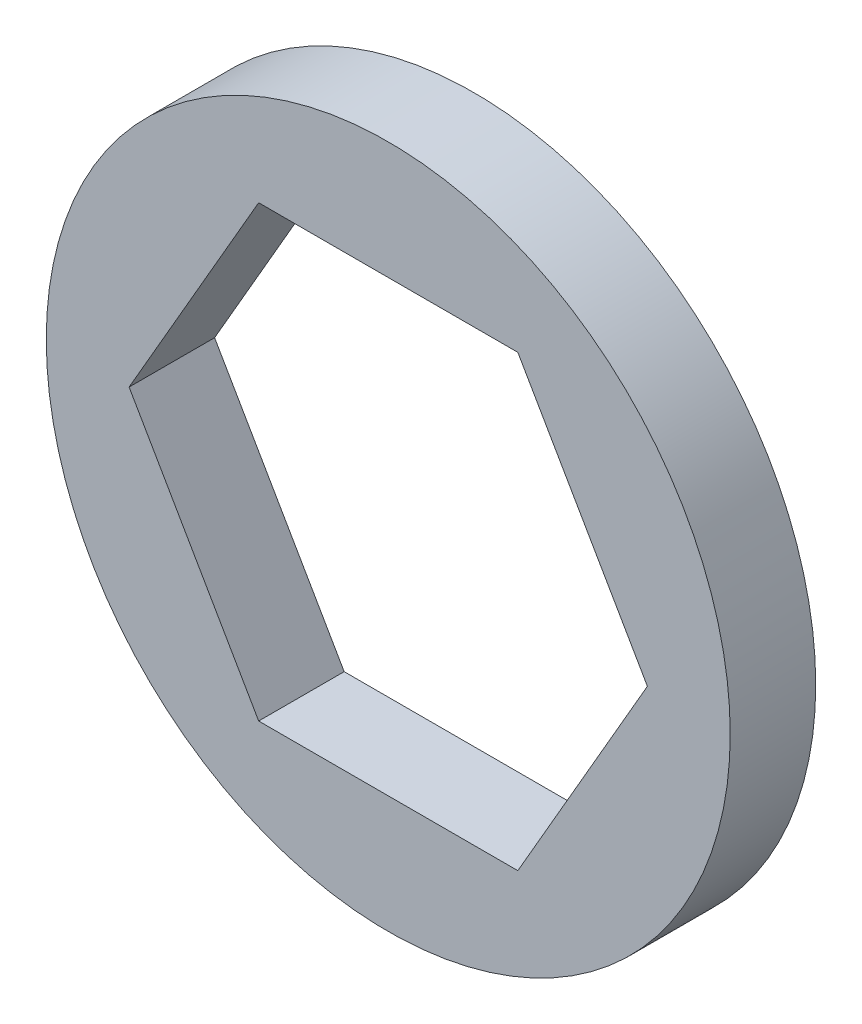
ISO-10303-21;
HEADER;
FILE_DESCRIPTION(('STEP AP214'),'2;1');
FILE_NAME('part.step','',(''),(''),'','','');
FILE_SCHEMA(('AUTOMOTIVE_DESIGN { 1 0 10303 214 1 1 1 1 }'));
ENDSEC;
DATA;
#1=APPLICATION_CONTEXT('core data for automotive mechanical design processes');
#2=APPLICATION_PROTOCOL_DEFINITION('international standard','automotive_design',2000,#1);
#3=PRODUCT_CONTEXT('',#1,'mechanical');
#4=PRODUCT('Part','Part','',(#3));
#5=PRODUCT_RELATED_PRODUCT_CATEGORY('part','',(#4));
#6=PRODUCT_DEFINITION_FORMATION('','',#4);
#7=PRODUCT_DEFINITION_CONTEXT('part definition',#1,'design');
#8=PRODUCT_DEFINITION('design','',#6,#7);
#9=PRODUCT_DEFINITION_SHAPE('','',#8);
#10=(LENGTH_UNIT() NAMED_UNIT(*) SI_UNIT(.MILLI.,.METRE.));
#11=(NAMED_UNIT(*) PLANE_ANGLE_UNIT() SI_UNIT($,.RADIAN.));
#12=(NAMED_UNIT(*) SI_UNIT($,.STERADIAN.) SOLID_ANGLE_UNIT());
#13=UNCERTAINTY_MEASURE_WITH_UNIT(LENGTH_MEASURE(1.E-05),#10,'distance_accuracy_value','');
#14=(GEOMETRIC_REPRESENTATION_CONTEXT(3) GLOBAL_UNCERTAINTY_ASSIGNED_CONTEXT((#13)) GLOBAL_UNIT_ASSIGNED_CONTEXT((#10,
#11,#12)) REPRESENTATION_CONTEXT('',''));
#15=CARTESIAN_POINT('',(0.,0.,0.));
#16=DIRECTION('',(0.,0.,1.));
#17=DIRECTION('',(1.,0.,0.));
#18=AXIS2_PLACEMENT_3D('',#15,#16,#17);
#19=CARTESIAN_POINT('',(0.,0.,1.));
#20=DIRECTION('',(0.,0.,1.));
#21=DIRECTION('',(1.,0.,0.));
#22=AXIS2_PLACEMENT_3D('',#19,#20,#21);
#23=PLANE('',#22);
#24=CARTESIAN_POINT('',(0.,0.,1.));
#25=DIRECTION('',(0.,0.,1.));
#26=DIRECTION('',(1.,0.,0.));
#27=AXIS2_PLACEMENT_3D('',#24,#25,#26);
#28=CIRCLE('',#27,4.);
#29=CARTESIAN_POINT('',(4.,0.,1.));
#30=VERTEX_POINT('',#29);
#31=EDGE_CURVE('E11',#30,#30,#28,.T.);
#32=ORIENTED_EDGE('',*,*,#31,.T.);
#33=EDGE_LOOP('',(#32));
#34=FACE_BOUND('',#33,.T.);
#35=DIRECTION('',(-0.500000000000001,0.866025403784438,0.));
#36=VECTOR('',#35,1.);
#37=CARTESIAN_POINT('',(3.03108891324552,0.,1.));
#38=LINE('',#37,#36);
#39=CARTESIAN_POINT('',(3.03108891324552,0.,1.));
#40=VERTEX_POINT('',#39);
#41=CARTESIAN_POINT('',(1.51554445662275,2.62499999999999,1.));
#42=VERTEX_POINT('',#41);
#43=EDGE_CURVE('E108',#40,#42,#38,.T.);
#44=ORIENTED_EDGE('',*,*,#43,.F.);
#45=DIRECTION('',(0.499999999999995,0.866025403784441,0.));
#46=VECTOR('',#45,1.);
#47=CARTESIAN_POINT('',(1.51554445662279,-2.62499999999997,1.));
#48=LINE('',#47,#46);
#49=CARTESIAN_POINT('',(1.51554445662279,-2.62499999999997,1.));
#50=VERTEX_POINT('',#49);
#51=EDGE_CURVE('E100',#50,#40,#48,.T.);
#52=ORIENTED_EDGE('',*,*,#51,.F.);
#53=DIRECTION('',(1.,0.,0.));
#54=VECTOR('',#53,1.);
#55=CARTESIAN_POINT('',(-1.51554445662274,-2.625,1.));
#56=LINE('',#55,#54);
#57=CARTESIAN_POINT('',(-1.51554445662274,-2.625,1.));
#58=VERTEX_POINT('',#57);
#59=EDGE_CURVE('E130',#58,#50,#56,.T.);
#60=ORIENTED_EDGE('',*,*,#59,.F.);
#61=DIRECTION('',(0.500000000000007,-0.866025403784435,0.));
#62=VECTOR('',#61,1.);
#63=CARTESIAN_POINT('',(-3.03108891324552,0.,1.));
#64=LINE('',#63,#62);
#65=CARTESIAN_POINT('',(-3.03108891324552,0.,1.));
#66=VERTEX_POINT('',#65);
#67=EDGE_CURVE('E127',#66,#58,#64,.T.);
#68=ORIENTED_EDGE('',*,*,#67,.F.);
#69=DIRECTION('',(-0.499999999999995,-0.866025403784442,0.));
#70=VECTOR('',#69,1.);
#71=CARTESIAN_POINT('',(-1.51554445662277,2.62499999999998,1.));
#72=LINE('',#71,#70);
#73=CARTESIAN_POINT('',(-1.51554445662277,2.62499999999998,1.));
#74=VERTEX_POINT('',#73);
#75=EDGE_CURVE('E122',#74,#66,#72,.T.);
#76=ORIENTED_EDGE('',*,*,#75,.F.);
#77=DIRECTION('',(-1.,0.,0.));
#78=VECTOR('',#77,1.);
#79=CARTESIAN_POINT('',(1.51554445662275,2.62499999999999,1.));
#80=LINE('',#79,#78);
#81=EDGE_CURVE('E120',#42,#74,#80,.T.);
#82=ORIENTED_EDGE('',*,*,#81,.F.);
#83=EDGE_LOOP('',(#44,#52,#60,#68,#76,#82));
#84=FACE_BOUND('',#83,.T.);
#85=ADVANCED_FACE('F45',(#34,#84),#23,.T.);
#86=CARTESIAN_POINT('',(0.,0.,0.));
#87=DIRECTION('',(0.,0.,1.));
#88=DIRECTION('',(1.,0.,0.));
#89=AXIS2_PLACEMENT_3D('',#86,#87,#88);
#90=PLANE('',#89);
#91=CARTESIAN_POINT('',(0.,0.,0.));
#92=DIRECTION('',(0.,0.,1.));
#93=DIRECTION('',(1.,0.,0.));
#94=AXIS2_PLACEMENT_3D('',#91,#92,#93);
#95=CIRCLE('',#94,4.);
#96=CARTESIAN_POINT('',(4.,0.,0.));
#97=VERTEX_POINT('',#96);
#98=EDGE_CURVE('E49',#97,#97,#95,.T.);
#99=ORIENTED_EDGE('',*,*,#98,.F.);
#100=EDGE_LOOP('',(#99));
#101=FACE_BOUND('',#100,.T.);
#102=DIRECTION('',(0.499999999999995,0.866025403784441,0.));
#103=VECTOR('',#102,1.);
#104=CARTESIAN_POINT('',(1.51554445662279,-2.62499999999997,0.));
#105=LINE('',#104,#103);
#106=CARTESIAN_POINT('',(1.51554445662279,-2.62499999999997,0.));
#107=VERTEX_POINT('',#106);
#108=CARTESIAN_POINT('',(3.03108891324552,0.,0.));
#109=VERTEX_POINT('',#108);
#110=EDGE_CURVE('E69',#107,#109,#105,.T.);
#111=ORIENTED_EDGE('',*,*,#110,.T.);
#112=DIRECTION('',(-0.500000000000001,0.866025403784438,0.));
#113=VECTOR('',#112,1.);
#114=CARTESIAN_POINT('',(3.03108891324552,0.,0.));
#115=LINE('',#114,#113);
#116=CARTESIAN_POINT('',(1.51554445662275,2.62499999999999,0.));
#117=VERTEX_POINT('',#116);
#118=EDGE_CURVE('E115',#109,#117,#115,.T.);
#119=ORIENTED_EDGE('',*,*,#118,.T.);
#120=DIRECTION('',(-1.,0.,0.));
#121=VECTOR('',#120,1.);
#122=CARTESIAN_POINT('',(1.51554445662275,2.62499999999999,0.));
#123=LINE('',#122,#121);
#124=CARTESIAN_POINT('',(-1.51554445662277,2.62499999999998,0.));
#125=VERTEX_POINT('',#124);
#126=EDGE_CURVE('E134',#117,#125,#123,.T.);
#127=ORIENTED_EDGE('',*,*,#126,.T.);
#128=DIRECTION('',(-0.499999999999995,-0.866025403784442,0.));
#129=VECTOR('',#128,1.);
#130=CARTESIAN_POINT('',(-1.51554445662277,2.62499999999998,0.));
#131=LINE('',#130,#129);
#132=CARTESIAN_POINT('',(-3.03108891324552,0.,0.));
#133=VERTEX_POINT('',#132);
#134=EDGE_CURVE('E137',#125,#133,#131,.T.);
#135=ORIENTED_EDGE('',*,*,#134,.T.);
#136=DIRECTION('',(0.500000000000007,-0.866025403784435,0.));
#137=VECTOR('',#136,1.);
#138=CARTESIAN_POINT('',(-3.03108891324552,0.,0.));
#139=LINE('',#138,#137);
#140=CARTESIAN_POINT('',(-1.51554445662274,-2.625,0.));
#141=VERTEX_POINT('',#140);
#142=EDGE_CURVE('E140',#133,#141,#139,.T.);
#143=ORIENTED_EDGE('',*,*,#142,.T.);
#144=DIRECTION('',(1.,0.,0.));
#145=VECTOR('',#144,1.);
#146=CARTESIAN_POINT('',(-1.51554445662274,-2.625,0.));
#147=LINE('',#146,#145);
#148=EDGE_CURVE('E109',#141,#107,#147,.T.);
#149=ORIENTED_EDGE('',*,*,#148,.T.);
#150=EDGE_LOOP('',(#111,#119,#127,#135,#143,#149));
#151=FACE_BOUND('',#150,.T.);
#152=ADVANCED_FACE('F158',(#101,#151),#90,.F.);
#153=CARTESIAN_POINT('',(0.,0.,1.));
#154=DIRECTION('',(0.,0.,-1.));
#155=DIRECTION('',(-1.,0.,0.));
#156=AXIS2_PLACEMENT_3D('',#153,#154,#155);
#157=CYLINDRICAL_SURFACE('',#156,4.);
#158=ORIENTED_EDGE('',*,*,#31,.F.);
#159=EDGE_LOOP('',(#158));
#160=FACE_BOUND('',#159,.T.);
#161=ORIENTED_EDGE('',*,*,#98,.T.);
#162=EDGE_LOOP('',(#161));
#163=FACE_BOUND('',#162,.T.);
#164=ADVANCED_FACE('F47',(#160,#163),#157,.T.);
#165=CARTESIAN_POINT('',(1.51554445662279,-2.62499999999997,1.));
#166=DIRECTION('',(-0.866025403784442,0.499999999999995,0.));
#167=DIRECTION('',(-0.499999999999995,-0.866025403784442,0.));
#168=AXIS2_PLACEMENT_3D('',#165,#166,#167);
#169=PLANE('',#168);
#170=ORIENTED_EDGE('',*,*,#110,.F.);
#171=DIRECTION('',(0.,0.,-1.));
#172=VECTOR('',#171,1.);
#173=CARTESIAN_POINT('',(1.51554445662279,-2.62499999999997,1.));
#174=LINE('',#173,#172);
#175=EDGE_CURVE('E104',#50,#107,#174,.T.);
#176=ORIENTED_EDGE('',*,*,#175,.F.);
#177=ORIENTED_EDGE('',*,*,#51,.T.);
#178=DIRECTION('',(0.,0.,-1.));
#179=VECTOR('',#178,1.);
#180=CARTESIAN_POINT('',(3.03108891324552,0.,1.));
#181=LINE('',#180,#179);
#182=EDGE_CURVE('E103',#40,#109,#181,.T.);
#183=ORIENTED_EDGE('',*,*,#182,.T.);
#184=EDGE_LOOP('',(#170,#176,#177,#183));
#185=FACE_BOUND('',#184,.T.);
#186=ADVANCED_FACE('F102',(#185),#169,.T.);
#187=CARTESIAN_POINT('',(3.03108891324552,0.,1.));
#188=DIRECTION('',(-0.866025403784438,-0.500000000000001,0.));
#189=DIRECTION('',(0.500000000000001,-0.866025403784438,0.));
#190=AXIS2_PLACEMENT_3D('',#187,#188,#189);
#191=PLANE('',#190);
#192=ORIENTED_EDGE('',*,*,#118,.F.);
#193=ORIENTED_EDGE('',*,*,#182,.F.);
#194=ORIENTED_EDGE('',*,*,#43,.T.);
#195=DIRECTION('',(0.,0.,-1.));
#196=VECTOR('',#195,1.);
#197=CARTESIAN_POINT('',(1.51554445662275,2.62499999999999,1.));
#198=LINE('',#197,#196);
#199=EDGE_CURVE('E116',#42,#117,#198,.T.);
#200=ORIENTED_EDGE('',*,*,#199,.T.);
#201=EDGE_LOOP('',(#192,#193,#194,#200));
#202=FACE_BOUND('',#201,.T.);
#203=ADVANCED_FACE('F112',(#202),#191,.T.);
#204=CARTESIAN_POINT('',(1.51554445662275,2.62499999999999,1.));
#205=DIRECTION('',(0.,-1.,0.));
#206=DIRECTION('',(1.,0.,0.));
#207=AXIS2_PLACEMENT_3D('',#204,#205,#206);
#208=PLANE('',#207);
#209=ORIENTED_EDGE('',*,*,#126,.F.);
#210=ORIENTED_EDGE('',*,*,#199,.F.);
#211=ORIENTED_EDGE('',*,*,#81,.T.);
#212=DIRECTION('',(0.,0.,-1.));
#213=VECTOR('',#212,1.);
#214=CARTESIAN_POINT('',(-1.51554445662277,2.62499999999998,1.));
#215=LINE('',#214,#213);
#216=EDGE_CURVE('E150',#74,#125,#215,.T.);
#217=ORIENTED_EDGE('',*,*,#216,.T.);
#218=EDGE_LOOP('',(#209,#210,#211,#217));
#219=FACE_BOUND('',#218,.T.);
#220=ADVANCED_FACE('F154',(#219),#208,.T.);
#221=CARTESIAN_POINT('',(-1.51554445662277,2.62499999999998,1.));
#222=DIRECTION('',(0.866025403784442,-0.499999999999995,0.));
#223=DIRECTION('',(0.499999999999995,0.866025403784442,0.));
#224=AXIS2_PLACEMENT_3D('',#221,#222,#223);
#225=PLANE('',#224);
#226=ORIENTED_EDGE('',*,*,#134,.F.);
#227=ORIENTED_EDGE('',*,*,#216,.F.);
#228=ORIENTED_EDGE('',*,*,#75,.T.);
#229=DIRECTION('',(0.,0.,-1.));
#230=VECTOR('',#229,1.);
#231=CARTESIAN_POINT('',(-3.03108891324552,0.,1.));
#232=LINE('',#231,#230);
#233=EDGE_CURVE('E147',#66,#133,#232,.T.);
#234=ORIENTED_EDGE('',*,*,#233,.T.);
#235=EDGE_LOOP('',(#226,#227,#228,#234));
#236=FACE_BOUND('',#235,.T.);
#237=ADVANCED_FACE('F166',(#236),#225,.T.);
#238=CARTESIAN_POINT('',(-3.03108891324552,0.,1.));
#239=DIRECTION('',(0.866025403784435,0.500000000000007,0.));
#240=DIRECTION('',(-0.500000000000007,0.866025403784435,0.));
#241=AXIS2_PLACEMENT_3D('',#238,#239,#240);
#242=PLANE('',#241);
#243=ORIENTED_EDGE('',*,*,#142,.F.);
#244=ORIENTED_EDGE('',*,*,#233,.F.);
#245=ORIENTED_EDGE('',*,*,#67,.T.);
#246=DIRECTION('',(0.,0.,-1.));
#247=VECTOR('',#246,1.);
#248=CARTESIAN_POINT('',(-1.51554445662274,-2.625,1.));
#249=LINE('',#248,#247);
#250=EDGE_CURVE('E61',#58,#141,#249,.T.);
#251=ORIENTED_EDGE('',*,*,#250,.T.);
#252=EDGE_LOOP('',(#243,#244,#245,#251));
#253=FACE_BOUND('',#252,.T.);
#254=ADVANCED_FACE('F164',(#253),#242,.T.);
#255=CARTESIAN_POINT('',(-1.51554445662274,-2.625,1.));
#256=DIRECTION('',(0.,1.,0.));
#257=DIRECTION('',(-1.,0.,0.));
#258=AXIS2_PLACEMENT_3D('',#255,#256,#257);
#259=PLANE('',#258);
#260=ORIENTED_EDGE('',*,*,#148,.F.);
#261=ORIENTED_EDGE('',*,*,#250,.F.);
#262=ORIENTED_EDGE('',*,*,#59,.T.);
#263=ORIENTED_EDGE('',*,*,#175,.T.);
#264=EDGE_LOOP('',(#260,#261,#262,#263));
#265=FACE_BOUND('',#264,.T.);
#266=ADVANCED_FACE('F160',(#265),#259,.T.);
#267=CLOSED_SHELL('',(#85,#152,#164,#186,#203,#220,#237,#254,#266));
#268=MANIFOLD_SOLID_BREP('B2',#267);
#269=ADVANCED_BREP_SHAPE_REPRESENTATION('',(#18,#268),#14);
#270=SHAPE_DEFINITION_REPRESENTATION(#9,#269);
ENDSEC;
END-ISO-10303-21;
